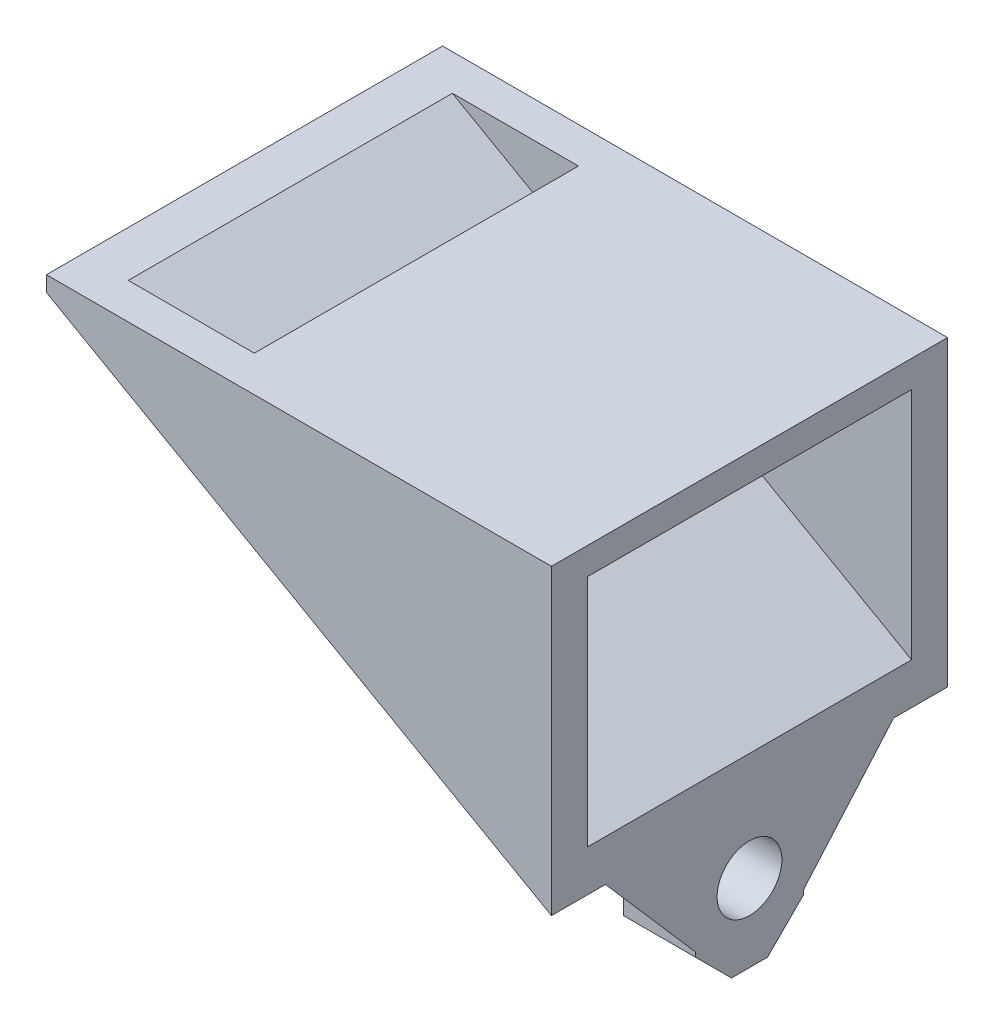
ISO-10303-21;
HEADER;
FILE_DESCRIPTION(('STEP AP214'),'2;1');
FILE_NAME('part.step','',(''),(''),'','','');
FILE_SCHEMA(('AUTOMOTIVE_DESIGN { 1 0 10303 214 1 1 1 1 }'));
ENDSEC;
DATA;
#1=APPLICATION_CONTEXT('core data for automotive mechanical design processes');
#2=APPLICATION_PROTOCOL_DEFINITION('international standard','automotive_design',2000,#1);
#3=PRODUCT_CONTEXT('',#1,'mechanical');
#4=PRODUCT('Part','Part','',(#3));
#5=PRODUCT_RELATED_PRODUCT_CATEGORY('part','',(#4));
#6=PRODUCT_DEFINITION_FORMATION('','',#4);
#7=PRODUCT_DEFINITION_CONTEXT('part definition',#1,'design');
#8=PRODUCT_DEFINITION('design','',#6,#7);
#9=PRODUCT_DEFINITION_SHAPE('','',#8);
#10=(LENGTH_UNIT() NAMED_UNIT(*) SI_UNIT(.MILLI.,.METRE.));
#11=(NAMED_UNIT(*) PLANE_ANGLE_UNIT() SI_UNIT($,.RADIAN.));
#12=(NAMED_UNIT(*) SI_UNIT($,.STERADIAN.) SOLID_ANGLE_UNIT());
#13=UNCERTAINTY_MEASURE_WITH_UNIT(LENGTH_MEASURE(1.E-05),#10,'distance_accuracy_value','');
#14=(GEOMETRIC_REPRESENTATION_CONTEXT(3) GLOBAL_UNCERTAINTY_ASSIGNED_CONTEXT((#13)) GLOBAL_UNIT_ASSIGNED_CONTEXT((#10,
#11,#12)) REPRESENTATION_CONTEXT('',''));
#15=CARTESIAN_POINT('',(0.,0.,0.));
#16=DIRECTION('',(0.,0.,1.));
#17=DIRECTION('',(1.,0.,0.));
#18=AXIS2_PLACEMENT_3D('',#15,#16,#17);
#19=CARTESIAN_POINT('',(0.,0.,0.));
#20=DIRECTION('',(0.,-1.,0.));
#21=DIRECTION('',(0.,0.,-1.));
#22=AXIS2_PLACEMENT_3D('',#19,#20,#21);
#23=PLANE('',#22);
#24=DIRECTION('',(-1.,0.,0.));
#25=VECTOR('',#24,1.);
#26=CARTESIAN_POINT('',(0.,0.,-11.));
#27=LINE('',#26,#25);
#28=CARTESIAN_POINT('',(10.,0.,-11.));
#29=VERTEX_POINT('',#28);
#30=CARTESIAN_POINT('',(-18.0461076258959,0.,-11.));
#31=VERTEX_POINT('',#30);
#32=EDGE_CURVE('E177',#29,#31,#27,.T.);
#33=ORIENTED_EDGE('',*,*,#32,.T.);
#34=DIRECTION('',(0.,0.,-1.));
#35=VECTOR('',#34,1.);
#36=CARTESIAN_POINT('',(-18.0461076258959,0.,11.));
#37=LINE('',#36,#35);
#38=CARTESIAN_POINT('',(-18.0461076258959,0.,11.));
#39=VERTEX_POINT('',#38);
#40=EDGE_CURVE('E162',#39,#31,#37,.T.);
#41=ORIENTED_EDGE('',*,*,#40,.F.);
#42=DIRECTION('',(1.,0.,0.));
#43=VECTOR('',#42,1.);
#44=CARTESIAN_POINT('',(0.,0.,11.));
#45=LINE('',#44,#43);
#46=CARTESIAN_POINT('',(10.,0.,11.));
#47=VERTEX_POINT('',#46);
#48=EDGE_CURVE('E174',#39,#47,#45,.T.);
#49=ORIENTED_EDGE('',*,*,#48,.T.);
#50=DIRECTION('',(0.,0.,1.));
#51=VECTOR('',#50,1.);
#52=CARTESIAN_POINT('',(10.,0.,0.));
#53=LINE('',#52,#51);
#54=EDGE_CURVE('E183',#29,#47,#53,.T.);
#55=ORIENTED_EDGE('',*,*,#54,.F.);
#56=EDGE_LOOP('',(#33,#41,#49,#55));
#57=FACE_BOUND('',#56,.T.);
#58=DIRECTION('',(0.,0.,-1.));
#59=VECTOR('',#58,1.);
#60=CARTESIAN_POINT('',(-8.5,0.,9.));
#61=LINE('',#60,#59);
#62=CARTESIAN_POINT('',(-8.5,0.,9.));
#63=VERTEX_POINT('',#62);
#64=CARTESIAN_POINT('',(-8.5,0.,-9.));
#65=VERTEX_POINT('',#64);
#66=EDGE_CURVE('E248',#63,#65,#61,.T.);
#67=ORIENTED_EDGE('',*,*,#66,.F.);
#68=DIRECTION('',(1.,0.,0.));
#69=VECTOR('',#68,1.);
#70=CARTESIAN_POINT('',(-15.5,0.,9.));
#71=LINE('',#70,#69);
#72=CARTESIAN_POINT('',(-15.5,0.,9.));
#73=VERTEX_POINT('',#72);
#74=EDGE_CURVE('E200',#73,#63,#71,.T.);
#75=ORIENTED_EDGE('',*,*,#74,.F.);
#76=DIRECTION('',(0.,0.,1.));
#77=VECTOR('',#76,1.);
#78=CARTESIAN_POINT('',(-15.5,0.,9.));
#79=LINE('',#78,#77);
#80=CARTESIAN_POINT('',(-15.5,0.,-9.));
#81=VERTEX_POINT('',#80);
#82=EDGE_CURVE('E256',#81,#73,#79,.T.);
#83=ORIENTED_EDGE('',*,*,#82,.F.);
#84=DIRECTION('',(-1.,0.,0.));
#85=VECTOR('',#84,1.);
#86=CARTESIAN_POINT('',(-15.5,0.,-9.));
#87=LINE('',#86,#85);
#88=EDGE_CURVE('E250',#65,#81,#87,.T.);
#89=ORIENTED_EDGE('',*,*,#88,.F.);
#90=EDGE_LOOP('',(#67,#75,#83,#89));
#91=FACE_BOUND('',#90,.T.);
#92=ADVANCED_FACE('F45',(#57,#91),#23,.F.);
#93=CARTESIAN_POINT('',(10.,0.,0.));
#94=DIRECTION('',(-1.,0.,0.));
#95=DIRECTION('',(0.,0.,1.));
#96=AXIS2_PLACEMENT_3D('',#93,#94,#95);
#97=PLANE('',#96);
#98=CARTESIAN_POINT('',(10.,-20.5,0.));
#99=DIRECTION('',(1.,0.,0.));
#100=DIRECTION('',(0.,0.,-1.));
#101=AXIS2_PLACEMENT_3D('',#98,#99,#100);
#102=CIRCLE('',#101,1.8);
#103=CARTESIAN_POINT('',(10.,-20.5,-1.8));
#104=VERTEX_POINT('',#103);
#105=EDGE_CURVE('E280',#104,#104,#102,.T.);
#106=ORIENTED_EDGE('',*,*,#105,.F.);
#107=EDGE_LOOP('',(#106));
#108=FACE_BOUND('',#107,.T.);
#109=DIRECTION('',(0.,-1.,0.));
#110=VECTOR('',#109,1.);
#111=CARTESIAN_POINT('',(10.,-16.8007278657055,3.));
#112=LINE('',#111,#110);
#113=CARTESIAN_POINT('',(10.,-22.5525475299693,3.));
#114=VERTEX_POINT('',#113);
#115=CARTESIAN_POINT('',(10.,-22.8007278657055,3.));
#116=VERTEX_POINT('',#115);
#117=EDGE_CURVE('E291',#114,#116,#112,.T.);
#118=ORIENTED_EDGE('',*,*,#117,.T.);
#119=DIRECTION('',(0.,-0.707106781186546,-0.707106781186549));
#120=VECTOR('',#119,1.);
#121=CARTESIAN_POINT('',(10.,-22.8007278657055,3.));
#122=LINE('',#121,#120);
#123=CARTESIAN_POINT('',(10.,-24.8007278657055,0.999999999999987));
#124=VERTEX_POINT('',#123);
#125=EDGE_CURVE('E381',#116,#124,#122,.T.);
#126=ORIENTED_EDGE('',*,*,#125,.T.);
#127=DIRECTION('',(0.,0.,-1.));
#128=VECTOR('',#127,1.);
#129=CARTESIAN_POINT('',(10.,-24.8007278657055,3.));
#130=LINE('',#129,#128);
#131=CARTESIAN_POINT('',(10.,-24.8007278657055,-0.999999999999995));
#132=VERTEX_POINT('',#131);
#133=EDGE_CURVE('E294',#124,#132,#130,.T.);
#134=ORIENTED_EDGE('',*,*,#133,.T.);
#135=DIRECTION('',(0.,0.707106781186549,-0.707106781186546));
#136=VECTOR('',#135,1.);
#137=CARTESIAN_POINT('',(10.,-24.8007278657055,-0.999999999999996));
#138=LINE('',#137,#136);
#139=CARTESIAN_POINT('',(10.,-22.8007278657055,-3.));
#140=VERTEX_POINT('',#139);
#141=EDGE_CURVE('E379',#132,#140,#138,.T.);
#142=ORIENTED_EDGE('',*,*,#141,.T.);
#143=DIRECTION('',(0.,1.,0.));
#144=VECTOR('',#143,1.);
#145=CARTESIAN_POINT('',(10.,-16.8007278657055,-3.));
#146=LINE('',#145,#144);
#147=CARTESIAN_POINT('',(10.,-22.5525475299693,-3.));
#148=VERTEX_POINT('',#147);
#149=EDGE_CURVE('E290',#140,#148,#146,.T.);
#150=ORIENTED_EDGE('',*,*,#149,.T.);
#151=DIRECTION('',(0.,-0.754708316761542,0.656060482433563));
#152=VECTOR('',#151,1.);
#153=CARTESIAN_POINT('',(10.,-11.192365694771,-12.8752938185629));
#154=LINE('',#153,#152);
#155=CARTESIAN_POINT('',(10.,-16.8007278657055,-8.00000000000008));
#156=VERTEX_POINT('',#155);
#157=EDGE_CURVE('E369',#148,#156,#154,.F.);
#158=ORIENTED_EDGE('',*,*,#157,.T.);
#159=DIRECTION('',(0.,0.,-1.));
#160=VECTOR('',#159,1.);
#161=CARTESIAN_POINT('',(10.,-16.8007278657055,0.));
#162=LINE('',#161,#160);
#163=CARTESIAN_POINT('',(10.,-16.8007278657055,-11.));
#164=VERTEX_POINT('',#163);
#165=EDGE_CURVE('E193',#156,#164,#162,.T.);
#166=ORIENTED_EDGE('',*,*,#165,.T.);
#167=DIRECTION('',(0.,1.,0.));
#168=VECTOR('',#167,1.);
#169=CARTESIAN_POINT('',(10.,0.,-11.));
#170=LINE('',#169,#168);
#171=EDGE_CURVE('E194',#164,#29,#170,.T.);
#172=ORIENTED_EDGE('',*,*,#171,.T.);
#173=ORIENTED_EDGE('',*,*,#54,.T.);
#174=DIRECTION('',(0.,-1.,0.));
#175=VECTOR('',#174,1.);
#176=CARTESIAN_POINT('',(10.,0.,11.));
#177=LINE('',#176,#175);
#178=CARTESIAN_POINT('',(10.,-16.8007278657055,11.));
#179=VERTEX_POINT('',#178);
#180=EDGE_CURVE('E182',#47,#179,#177,.T.);
#181=ORIENTED_EDGE('',*,*,#180,.T.);
#182=CARTESIAN_POINT('',(10.,-16.8007278657055,8.00000000000009));
#183=VERTEX_POINT('',#182);
#184=EDGE_CURVE('E195',#179,#183,#162,.T.);
#185=ORIENTED_EDGE('',*,*,#184,.T.);
#186=DIRECTION('',(0.,0.754708316761542,0.656060482433563));
#187=VECTOR('',#186,1.);
#188=CARTESIAN_POINT('',(10.,-11.192365694771,12.8752938185629));
#189=LINE('',#188,#187);
#190=EDGE_CURVE('E371',#183,#114,#189,.F.);
#191=ORIENTED_EDGE('',*,*,#190,.T.);
#192=EDGE_LOOP('',(#118,#126,#134,#142,#150,#158,#166,#172,#173,#181,#185,#191));
#193=FACE_BOUND('',#192,.T.);
#194=DIRECTION('',(0.,1.,0.));
#195=VECTOR('',#194,1.);
#196=CARTESIAN_POINT('',(10.,-14.5,-9.));
#197=LINE('',#196,#195);
#198=CARTESIAN_POINT('',(10.,-14.5,-9.));
#199=VERTEX_POINT('',#198);
#200=CARTESIAN_POINT('',(10.,-1.5,-9.));
#201=VERTEX_POINT('',#200);
#202=EDGE_CURVE('E302',#199,#201,#197,.T.);
#203=ORIENTED_EDGE('',*,*,#202,.F.);
#204=DIRECTION('',(0.,0.,-1.));
#205=VECTOR('',#204,1.);
#206=CARTESIAN_POINT('',(10.,-14.5,9.));
#207=LINE('',#206,#205);
#208=CARTESIAN_POINT('',(10.,-14.5,9.));
#209=VERTEX_POINT('',#208);
#210=EDGE_CURVE('E207',#209,#199,#207,.T.);
#211=ORIENTED_EDGE('',*,*,#210,.F.);
#212=DIRECTION('',(0.,-1.,0.));
#213=VECTOR('',#212,1.);
#214=CARTESIAN_POINT('',(10.,-14.5,9.));
#215=LINE('',#214,#213);
#216=CARTESIAN_POINT('',(10.,-1.5,9.));
#217=VERTEX_POINT('',#216);
#218=EDGE_CURVE('E344',#217,#209,#215,.T.);
#219=ORIENTED_EDGE('',*,*,#218,.F.);
#220=DIRECTION('',(0.,0.,1.));
#221=VECTOR('',#220,1.);
#222=CARTESIAN_POINT('',(10.,-1.5,9.));
#223=LINE('',#222,#221);
#224=EDGE_CURVE('E349',#201,#217,#223,.T.);
#225=ORIENTED_EDGE('',*,*,#224,.F.);
#226=EDGE_LOOP('',(#203,#211,#219,#225));
#227=FACE_BOUND('',#226,.T.);
#228=ADVANCED_FACE('F214',(#108,#193,#227),#97,.F.);
#229=CARTESIAN_POINT('',(0.,0.,11.));
#230=DIRECTION('',(0.,0.,1.));
#231=DIRECTION('',(1.,0.,0.));
#232=AXIS2_PLACEMENT_3D('',#229,#230,#231);
#233=PLANE('',#232);
#234=DIRECTION('',(0.,-1.,0.));
#235=VECTOR('',#234,1.);
#236=CARTESIAN_POINT('',(-18.0461076258959,0.,11.));
#237=LINE('',#236,#235);
#238=CARTESIAN_POINT('',(-18.0461076258959,-0.852941176470586,11.));
#239=VERTEX_POINT('',#238);
#240=EDGE_CURVE('E159',#39,#239,#237,.T.);
#241=ORIENTED_EDGE('',*,*,#240,.T.);
#242=DIRECTION('',(-0.869290118927954,0.494302224488444,0.));
#243=VECTOR('',#242,1.);
#244=CARTESIAN_POINT('',(-4.77579213055736,-8.39880685029054,11.));
#245=LINE('',#244,#243);
#246=EDGE_CURVE('E198',#179,#239,#245,.T.);
#247=ORIENTED_EDGE('',*,*,#246,.F.);
#248=ORIENTED_EDGE('',*,*,#180,.F.);
#249=ORIENTED_EDGE('',*,*,#48,.F.);
#250=EDGE_LOOP('',(#241,#247,#248,#249));
#251=FACE_BOUND('',#250,.T.);
#252=ADVANCED_FACE('F180',(#251),#233,.T.);
#253=CARTESIAN_POINT('',(-4.77579213055736,-8.39880685029054,0.));
#254=DIRECTION('',(0.494302224488444,0.869290118927954,0.));
#255=DIRECTION('',(-0.869290118927954,0.494302224488444,0.));
#256=AXIS2_PLACEMENT_3D('',#253,#254,#255);
#257=PLANE('',#256);
#258=ORIENTED_EDGE('',*,*,#165,.F.);
#259=DIRECTION('',(-0.869290118927954,0.494302224488444,0.));
#260=VECTOR('',#259,1.);
#261=CARTESIAN_POINT('',(6.,-14.5262180617839,-8.00000000000008));
#262=LINE('',#261,#260);
#263=CARTESIAN_POINT('',(6.,-14.5262180617839,-8.00000000000008));
#264=VERTEX_POINT('',#263);
#265=EDGE_CURVE('E360',#156,#264,#262,.T.);
#266=ORIENTED_EDGE('',*,*,#265,.T.);
#267=DIRECTION('',(0.,0.,1.));
#268=VECTOR('',#267,1.);
#269=CARTESIAN_POINT('',(6.,-14.5262180617839,-3.));
#270=LINE('',#269,#268);
#271=CARTESIAN_POINT('',(6.,-14.5262180617839,8.00000000000009));
#272=VERTEX_POINT('',#271);
#273=EDGE_CURVE('E289',#264,#272,#270,.T.);
#274=ORIENTED_EDGE('',*,*,#273,.T.);
#275=DIRECTION('',(0.869290118927954,-0.494302224488444,0.));
#276=VECTOR('',#275,1.);
#277=CARTESIAN_POINT('',(9.99999999999999,-16.8007278657055,8.00000000000009));
#278=LINE('',#277,#276);
#279=EDGE_CURVE('E185',#272,#183,#278,.T.);
#280=ORIENTED_EDGE('',*,*,#279,.T.);
#281=ORIENTED_EDGE('',*,*,#184,.F.);
#282=ORIENTED_EDGE('',*,*,#246,.T.);
#283=DIRECTION('',(0.,0.,-1.));
#284=VECTOR('',#283,1.);
#285=CARTESIAN_POINT('',(-18.0461076258959,-0.852941176470586,11.));
#286=LINE('',#285,#284);
#287=CARTESIAN_POINT('',(-18.0461076258959,-0.852941176470589,-11.));
#288=VERTEX_POINT('',#287);
#289=EDGE_CURVE('E165',#239,#288,#286,.T.);
#290=ORIENTED_EDGE('',*,*,#289,.T.);
#291=DIRECTION('',(-0.869290118927954,0.494302224488444,0.));
#292=VECTOR('',#291,1.);
#293=CARTESIAN_POINT('',(-4.77579213055736,-8.39880685029054,-11.));
#294=LINE('',#293,#292);
#295=EDGE_CURVE('E187',#164,#288,#294,.T.);
#296=ORIENTED_EDGE('',*,*,#295,.F.);
#297=EDGE_LOOP('',(#258,#266,#274,#280,#281,#282,#290,#296));
#298=FACE_BOUND('',#297,.T.);
#299=ADVANCED_FACE('F277',(#298),#257,.F.);
#300=CARTESIAN_POINT('',(0.,0.,-11.));
#301=DIRECTION('',(0.,0.,-1.));
#302=DIRECTION('',(-1.,0.,0.));
#303=AXIS2_PLACEMENT_3D('',#300,#301,#302);
#304=PLANE('',#303);
#305=DIRECTION('',(0.,-1.,0.));
#306=VECTOR('',#305,1.);
#307=CARTESIAN_POINT('',(-18.0461076258959,0.,-11.));
#308=LINE('',#307,#306);
#309=EDGE_CURVE('E169',#31,#288,#308,.T.);
#310=ORIENTED_EDGE('',*,*,#309,.F.);
#311=ORIENTED_EDGE('',*,*,#32,.F.);
#312=ORIENTED_EDGE('',*,*,#171,.F.);
#313=ORIENTED_EDGE('',*,*,#295,.T.);
#314=EDGE_LOOP('',(#310,#311,#312,#313));
#315=FACE_BOUND('',#314,.T.);
#316=ADVANCED_FACE('F275',(#315),#304,.T.);
#317=CARTESIAN_POINT('',(0.,0.,9.));
#318=DIRECTION('',(0.,0.,1.));
#319=DIRECTION('',(1.,0.,0.));
#320=AXIS2_PLACEMENT_3D('',#317,#318,#319);
#321=PLANE('',#320);
#322=DIRECTION('',(-0.996729048114676,0.0808158687660549,0.));
#323=VECTOR('',#322,1.);
#324=CARTESIAN_POINT('',(10.,-1.5,9.));
#325=LINE('',#324,#323);
#326=EDGE_CURVE('E343',#217,#63,#325,.T.);
#327=ORIENTED_EDGE('',*,*,#326,.F.);
#328=ORIENTED_EDGE('',*,*,#218,.T.);
#329=DIRECTION('',(-0.869290118927954,0.494302224488444,0.));
#330=VECTOR('',#329,1.);
#331=CARTESIAN_POINT('',(10.,-14.5,9.));
#332=LINE('',#331,#330);
#333=EDGE_CURVE('E313',#209,#73,#332,.T.);
#334=ORIENTED_EDGE('',*,*,#333,.T.);
#335=ORIENTED_EDGE('',*,*,#74,.T.);
#336=EDGE_LOOP('',(#327,#328,#334,#335));
#337=FACE_BOUND('',#336,.T.);
#338=ADVANCED_FACE('F325',(#337),#321,.F.);
#339=CARTESIAN_POINT('',(-3.78718768158048,-6.66022661243463,0.));
#340=DIRECTION('',(0.494302224488444,0.869290118927954,0.));
#341=DIRECTION('',(-0.869290118927954,0.494302224488444,0.));
#342=AXIS2_PLACEMENT_3D('',#339,#340,#341);
#343=PLANE('',#342);
#344=ORIENTED_EDGE('',*,*,#333,.F.);
#345=ORIENTED_EDGE('',*,*,#210,.T.);
#346=DIRECTION('',(-0.869290118927954,0.494302224488444,0.));
#347=VECTOR('',#346,1.);
#348=CARTESIAN_POINT('',(10.,-14.5,-9.));
#349=LINE('',#348,#347);
#350=EDGE_CURVE('E254',#199,#81,#349,.T.);
#351=ORIENTED_EDGE('',*,*,#350,.T.);
#352=ORIENTED_EDGE('',*,*,#82,.T.);
#353=EDGE_LOOP('',(#344,#345,#351,#352));
#354=FACE_BOUND('',#353,.T.);
#355=ADVANCED_FACE('F315',(#354),#343,.T.);
#356=CARTESIAN_POINT('',(-0.0555152394775037,-0.684687953555879,0.));
#357=DIRECTION('',(-0.0808158687660549,-0.996729048114676,0.));
#358=DIRECTION('',(0.996729048114676,-0.0808158687660549,0.));
#359=AXIS2_PLACEMENT_3D('',#356,#357,#358);
#360=PLANE('',#359);
#361=DIRECTION('',(-0.996729048114676,0.0808158687660549,0.));
#362=VECTOR('',#361,1.);
#363=CARTESIAN_POINT('',(10.,-1.5,-9.));
#364=LINE('',#363,#362);
#365=EDGE_CURVE('E258',#201,#65,#364,.T.);
#366=ORIENTED_EDGE('',*,*,#365,.F.);
#367=ORIENTED_EDGE('',*,*,#224,.T.);
#368=ORIENTED_EDGE('',*,*,#326,.T.);
#369=ORIENTED_EDGE('',*,*,#66,.T.);
#370=EDGE_LOOP('',(#366,#367,#368,#369));
#371=FACE_BOUND('',#370,.T.);
#372=ADVANCED_FACE('F324',(#371),#360,.T.);
#373=CARTESIAN_POINT('',(0.,0.,-9.));
#374=DIRECTION('',(0.,0.,-1.));
#375=DIRECTION('',(-1.,0.,0.));
#376=AXIS2_PLACEMENT_3D('',#373,#374,#375);
#377=PLANE('',#376);
#378=ORIENTED_EDGE('',*,*,#350,.F.);
#379=ORIENTED_EDGE('',*,*,#202,.T.);
#380=ORIENTED_EDGE('',*,*,#365,.T.);
#381=ORIENTED_EDGE('',*,*,#88,.T.);
#382=EDGE_LOOP('',(#378,#379,#380,#381));
#383=FACE_BOUND('',#382,.T.);
#384=ADVANCED_FACE('F225',(#383),#377,.F.);
#385=CARTESIAN_POINT('',(10.,-7.91022554293571,3.));
#386=DIRECTION('',(0.,0.,-1.));
#387=DIRECTION('',(-1.,0.,0.));
#388=AXIS2_PLACEMENT_3D('',#385,#386,#387);
#389=PLANE('',#388);
#390=DIRECTION('',(0.,-1.,0.));
#391=VECTOR('',#390,1.);
#392=CARTESIAN_POINT('',(6.,-7.91022554293571,3.));
#393=LINE('',#392,#391);
#394=CARTESIAN_POINT('',(6.,-20.2780377260478,3.));
#395=VERTEX_POINT('',#394);
#396=CARTESIAN_POINT('',(6.,-22.8007278657055,3.));
#397=VERTEX_POINT('',#396);
#398=EDGE_CURVE('E299',#395,#397,#393,.T.);
#399=ORIENTED_EDGE('',*,*,#398,.T.);
#400=DIRECTION('',(1.,0.,0.));
#401=VECTOR('',#400,1.);
#402=CARTESIAN_POINT('',(10.,-22.8007278657055,3.));
#403=LINE('',#402,#401);
#404=EDGE_CURVE('E376',#397,#116,#403,.T.);
#405=ORIENTED_EDGE('',*,*,#404,.T.);
#406=ORIENTED_EDGE('',*,*,#117,.F.);
#407=DIRECTION('',(-0.869290118927954,0.494302224488444,0.));
#408=VECTOR('',#407,1.);
#409=CARTESIAN_POINT('',(3.52848887755776,-18.8726686564237,3.));
#410=LINE('',#409,#408);
#411=EDGE_CURVE('E365',#114,#395,#410,.T.);
#412=ORIENTED_EDGE('',*,*,#411,.T.);
#413=EDGE_LOOP('',(#399,#405,#406,#412));
#414=FACE_BOUND('',#413,.T.);
#415=ADVANCED_FACE('F396',(#414),#389,.F.);
#416=CARTESIAN_POINT('',(6.,-7.91022554293571,-3.));
#417=DIRECTION('',(1.,0.,0.));
#418=DIRECTION('',(0.,0.,-1.));
#419=AXIS2_PLACEMENT_3D('',#416,#417,#418);
#420=PLANE('',#419);
#421=CARTESIAN_POINT('',(6.,-20.5,0.));
#422=DIRECTION('',(1.,0.,0.));
#423=DIRECTION('',(0.,0.,-1.));
#424=AXIS2_PLACEMENT_3D('',#421,#422,#423);
#425=CIRCLE('',#424,1.8);
#426=CARTESIAN_POINT('',(6.,-20.5,-1.8));
#427=VERTEX_POINT('',#426);
#428=EDGE_CURVE('E283',#427,#427,#425,.T.);
#429=ORIENTED_EDGE('',*,*,#428,.T.);
#430=EDGE_LOOP('',(#429));
#431=FACE_BOUND('',#430,.T.);
#432=DIRECTION('',(0.,0.,-1.));
#433=VECTOR('',#432,1.);
#434=CARTESIAN_POINT('',(6.,-24.8007278657055,3.));
#435=LINE('',#434,#433);
#436=CARTESIAN_POINT('',(6.,-24.8007278657055,0.999999999999984));
#437=VERTEX_POINT('',#436);
#438=CARTESIAN_POINT('',(6.,-24.8007278657055,-0.999999999999997));
#439=VERTEX_POINT('',#438);
#440=EDGE_CURVE('E287',#437,#439,#435,.T.);
#441=ORIENTED_EDGE('',*,*,#440,.F.);
#442=DIRECTION('',(0.,0.707106781186546,0.707106781186549));
#443=VECTOR('',#442,1.);
#444=CARTESIAN_POINT('',(6.,-22.8007278657055,3.));
#445=LINE('',#444,#443);
#446=EDGE_CURVE('E54',#437,#397,#445,.T.);
#447=ORIENTED_EDGE('',*,*,#446,.T.);
#448=ORIENTED_EDGE('',*,*,#398,.F.);
#449=DIRECTION('',(0.,-0.754708316761542,-0.656060482433563));
#450=VECTOR('',#449,1.);
#451=CARTESIAN_POINT('',(6.,-16.2043276485745,6.54123591772481));
#452=LINE('',#451,#450);
#453=EDGE_CURVE('E373',#395,#272,#452,.F.);
#454=ORIENTED_EDGE('',*,*,#453,.T.);
#455=ORIENTED_EDGE('',*,*,#273,.F.);
#456=DIRECTION('',(0.,0.754708316761542,-0.656060482433563));
#457=VECTOR('',#456,1.);
#458=CARTESIAN_POINT('',(6.,-13.2335218342273,-9.12372805739057));
#459=LINE('',#458,#457);
#460=CARTESIAN_POINT('',(6.,-20.2780377260478,-3.));
#461=VERTEX_POINT('',#460);
#462=EDGE_CURVE('E367',#264,#461,#459,.F.);
#463=ORIENTED_EDGE('',*,*,#462,.T.);
#464=DIRECTION('',(0.,-1.,0.));
#465=VECTOR('',#464,1.);
#466=CARTESIAN_POINT('',(6.,-7.91022554293571,-3.));
#467=LINE('',#466,#465);
#468=CARTESIAN_POINT('',(6.,-22.8007278657055,-3.));
#469=VERTEX_POINT('',#468);
#470=EDGE_CURVE('E300',#461,#469,#467,.T.);
#471=ORIENTED_EDGE('',*,*,#470,.T.);
#472=DIRECTION('',(0.,-0.707106781186549,0.707106781186546));
#473=VECTOR('',#472,1.);
#474=CARTESIAN_POINT('',(6.,-24.8007278657055,-0.999999999999997));
#475=LINE('',#474,#473);
#476=EDGE_CURVE('E66',#469,#439,#475,.T.);
#477=ORIENTED_EDGE('',*,*,#476,.T.);
#478=EDGE_LOOP('',(#441,#447,#448,#454,#455,#463,#471,#477));
#479=FACE_BOUND('',#478,.T.);
#480=ADVANCED_FACE('F390',(#431,#479),#420,.F.);
#481=CARTESIAN_POINT('',(10.,-7.91022554293571,-3.));
#482=DIRECTION('',(0.,0.,1.));
#483=DIRECTION('',(1.,0.,0.));
#484=AXIS2_PLACEMENT_3D('',#481,#482,#483);
#485=PLANE('',#484);
#486=ORIENTED_EDGE('',*,*,#149,.F.);
#487=DIRECTION('',(-1.,0.,0.));
#488=VECTOR('',#487,1.);
#489=CARTESIAN_POINT('',(6.,-22.8007278657055,-3.));
#490=LINE('',#489,#488);
#491=EDGE_CURVE('E12',#140,#469,#490,.T.);
#492=ORIENTED_EDGE('',*,*,#491,.T.);
#493=ORIENTED_EDGE('',*,*,#470,.F.);
#494=DIRECTION('',(0.869290118927954,-0.494302224488444,0.));
#495=VECTOR('',#494,1.);
#496=CARTESIAN_POINT('',(7.52848887755776,-21.1471784603453,-3.));
#497=LINE('',#496,#495);
#498=EDGE_CURVE('E362',#461,#148,#497,.T.);
#499=ORIENTED_EDGE('',*,*,#498,.T.);
#500=EDGE_LOOP('',(#486,#492,#493,#499));
#501=FACE_BOUND('',#500,.T.);
#502=ADVANCED_FACE('F406',(#501),#485,.F.);
#503=CARTESIAN_POINT('',(6.,-24.8007278657055,3.));
#504=DIRECTION('',(0.,-1.,0.));
#505=DIRECTION('',(0.,0.,-1.));
#506=AXIS2_PLACEMENT_3D('',#503,#504,#505);
#507=PLANE('',#506);
#508=ORIENTED_EDGE('',*,*,#133,.F.);
#509=DIRECTION('',(-1.,0.,0.));
#510=VECTOR('',#509,1.);
#511=CARTESIAN_POINT('',(6.,-24.8007278657055,0.999999999999984));
#512=LINE('',#511,#510);
#513=EDGE_CURVE('E386',#124,#437,#512,.T.);
#514=ORIENTED_EDGE('',*,*,#513,.T.);
#515=ORIENTED_EDGE('',*,*,#440,.T.);
#516=DIRECTION('',(1.,0.,0.));
#517=VECTOR('',#516,1.);
#518=CARTESIAN_POINT('',(10.,-24.8007278657055,-0.999999999999994));
#519=LINE('',#518,#517);
#520=EDGE_CURVE('E383',#439,#132,#519,.T.);
#521=ORIENTED_EDGE('',*,*,#520,.T.);
#522=EDGE_LOOP('',(#508,#514,#515,#521));
#523=FACE_BOUND('',#522,.T.);
#524=ADVANCED_FACE('F403',(#523),#507,.T.);
#525=CARTESIAN_POINT('',(0.,-20.5,0.));
#526=DIRECTION('',(1.,0.,0.));
#527=DIRECTION('',(0.,0.,-1.));
#528=AXIS2_PLACEMENT_3D('',#525,#526,#527);
#529=CYLINDRICAL_SURFACE('',#528,1.8);
#530=ORIENTED_EDGE('',*,*,#105,.T.);
#531=EDGE_LOOP('',(#530));
#532=FACE_BOUND('',#531,.T.);
#533=ORIENTED_EDGE('',*,*,#428,.F.);
#534=EDGE_LOOP('',(#533));
#535=FACE_BOUND('',#534,.T.);
#536=ADVANCED_FACE('F457',(#532,#535),#529,.F.);
#537=CARTESIAN_POINT('',(-18.0461076258959,0.,11.));
#538=DIRECTION('',(1.,0.,0.));
#539=DIRECTION('',(0.,0.,-1.));
#540=AXIS2_PLACEMENT_3D('',#537,#538,#539);
#541=PLANE('',#540);
#542=ORIENTED_EDGE('',*,*,#309,.T.);
#543=ORIENTED_EDGE('',*,*,#289,.F.);
#544=ORIENTED_EDGE('',*,*,#240,.F.);
#545=ORIENTED_EDGE('',*,*,#40,.T.);
#546=EDGE_LOOP('',(#542,#543,#544,#545));
#547=FACE_BOUND('',#546,.T.);
#548=ADVANCED_FACE('F161',(#547),#541,.F.);
#549=CARTESIAN_POINT('',(-4.77579213055736,-8.39880685029054,-8.00000000000009));
#550=DIRECTION('',(-0.349524454891375,-0.614680937912419,-0.707106781186544));
#551=DIRECTION('',(0.869290118927954,-0.494302224488444,0.));
#552=AXIS2_PLACEMENT_3D('',#549,#550,#551);
#553=PLANE('',#552);
#554=ORIENTED_EDGE('',*,*,#157,.F.);
#555=ORIENTED_EDGE('',*,*,#498,.F.);
#556=ORIENTED_EDGE('',*,*,#462,.F.);
#557=ORIENTED_EDGE('',*,*,#265,.F.);
#558=EDGE_LOOP('',(#554,#555,#556,#557));
#559=FACE_BOUND('',#558,.T.);
#560=ADVANCED_FACE('F411',(#559),#553,.T.);
#561=CARTESIAN_POINT('',(-4.77579213055737,-8.39880685029053,8.00000000000008));
#562=DIRECTION('',(-0.349524454891376,-0.614680937912419,0.707106781186544));
#563=DIRECTION('',(-0.869290118927954,0.494302224488444,0.));
#564=AXIS2_PLACEMENT_3D('',#561,#562,#563);
#565=PLANE('',#564);
#566=ORIENTED_EDGE('',*,*,#453,.F.);
#567=ORIENTED_EDGE('',*,*,#411,.F.);
#568=ORIENTED_EDGE('',*,*,#190,.F.);
#569=ORIENTED_EDGE('',*,*,#279,.F.);
#570=EDGE_LOOP('',(#566,#567,#568,#569));
#571=FACE_BOUND('',#570,.T.);
#572=ADVANCED_FACE('F414',(#571),#565,.T.);
#573=CARTESIAN_POINT('',(10.,-22.8007278657055,3.));
#574=DIRECTION('',(0.,-0.707106781186549,0.707106781186546));
#575=DIRECTION('',(-1.,0.,0.));
#576=AXIS2_PLACEMENT_3D('',#573,#574,#575);
#577=PLANE('',#576);
#578=ORIENTED_EDGE('',*,*,#446,.F.);
#579=ORIENTED_EDGE('',*,*,#513,.F.);
#580=ORIENTED_EDGE('',*,*,#125,.F.);
#581=ORIENTED_EDGE('',*,*,#404,.F.);
#582=EDGE_LOOP('',(#578,#579,#580,#581));
#583=FACE_BOUND('',#582,.T.);
#584=ADVANCED_FACE('F399',(#583),#577,.T.);
#585=CARTESIAN_POINT('',(6.,-24.8007278657055,-0.999999999999997));
#586=DIRECTION('',(0.,-0.707106781186546,-0.707106781186549));
#587=DIRECTION('',(-1.,0.,0.));
#588=AXIS2_PLACEMENT_3D('',#585,#586,#587);
#589=PLANE('',#588);
#590=ORIENTED_EDGE('',*,*,#476,.F.);
#591=ORIENTED_EDGE('',*,*,#491,.F.);
#592=ORIENTED_EDGE('',*,*,#141,.F.);
#593=ORIENTED_EDGE('',*,*,#520,.F.);
#594=EDGE_LOOP('',(#590,#591,#592,#593));
#595=FACE_BOUND('',#594,.T.);
#596=ADVANCED_FACE('F48',(#595),#589,.T.);
#597=CLOSED_SHELL('',(#92,#228,#252,#299,#316,#338,#355,#372,#384,#415,#480,#502,#524,#536,#548,
#560,#572,#584,#596));
#598=MANIFOLD_SOLID_BREP('B2',#597);
#599=ADVANCED_BREP_SHAPE_REPRESENTATION('',(#18,#598),#14);
#600=SHAPE_DEFINITION_REPRESENTATION(#9,#599);
ENDSEC;
END-ISO-10303-21;
